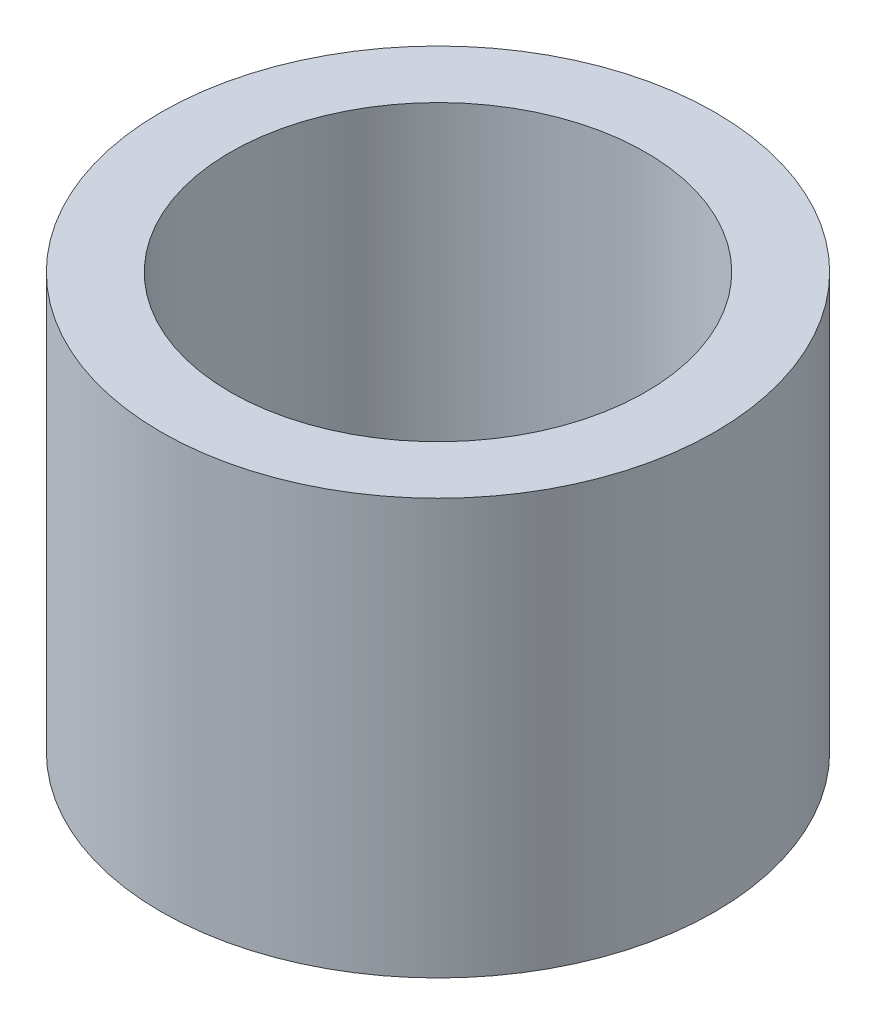
ISO-10303-21;
HEADER;
FILE_DESCRIPTION(('STEP AP214'),'2;1');
FILE_NAME('part.step','',(''),(''),'','','');
FILE_SCHEMA(('AUTOMOTIVE_DESIGN { 1 0 10303 214 1 1 1 1 }'));
ENDSEC;
DATA;
#1=APPLICATION_CONTEXT('core data for automotive mechanical design processes');
#2=APPLICATION_PROTOCOL_DEFINITION('international standard','automotive_design',2000,#1);
#3=PRODUCT_CONTEXT('',#1,'mechanical');
#4=PRODUCT('Part','Part','',(#3));
#5=PRODUCT_RELATED_PRODUCT_CATEGORY('part','',(#4));
#6=PRODUCT_DEFINITION_FORMATION('','',#4);
#7=PRODUCT_DEFINITION_CONTEXT('part definition',#1,'design');
#8=PRODUCT_DEFINITION('design','',#6,#7);
#9=PRODUCT_DEFINITION_SHAPE('','',#8);
#10=(LENGTH_UNIT() NAMED_UNIT(*) SI_UNIT(.MILLI.,.METRE.));
#11=(NAMED_UNIT(*) PLANE_ANGLE_UNIT() SI_UNIT($,.RADIAN.));
#12=(NAMED_UNIT(*) SI_UNIT($,.STERADIAN.) SOLID_ANGLE_UNIT());
#13=UNCERTAINTY_MEASURE_WITH_UNIT(LENGTH_MEASURE(1.E-05),#10,'distance_accuracy_value','');
#14=(GEOMETRIC_REPRESENTATION_CONTEXT(3) GLOBAL_UNCERTAINTY_ASSIGNED_CONTEXT((#13)) GLOBAL_UNIT_ASSIGNED_CONTEXT((#10,
#11,#12)) REPRESENTATION_CONTEXT('',''));
#15=CARTESIAN_POINT('',(0.,0.,0.));
#16=DIRECTION('',(0.,0.,1.));
#17=DIRECTION('',(1.,0.,0.));
#18=AXIS2_PLACEMENT_3D('',#15,#16,#17);
#19=CARTESIAN_POINT('',(0.,6.,0.));
#20=DIRECTION('',(0.,1.,0.));
#21=DIRECTION('',(0.,0.,1.));
#22=AXIS2_PLACEMENT_3D('',#19,#20,#21);
#23=PLANE('',#22);
#24=CARTESIAN_POINT('',(0.,6.,0.));
#25=DIRECTION('',(0.,1.,0.));
#26=DIRECTION('',(0.,0.,1.));
#27=AXIS2_PLACEMENT_3D('',#24,#25,#26);
#28=CIRCLE('',#27,4.);
#29=CARTESIAN_POINT('',(0.,6.,4.));
#30=VERTEX_POINT('',#29);
#31=EDGE_CURVE('E10',#30,#30,#28,.T.);
#32=ORIENTED_EDGE('',*,*,#31,.T.);
#33=EDGE_LOOP('',(#32));
#34=FACE_BOUND('',#33,.T.);
#35=CARTESIAN_POINT('',(0.,6.,0.));
#36=DIRECTION('',(0.,1.,0.));
#37=DIRECTION('',(0.,0.,1.));
#38=AXIS2_PLACEMENT_3D('',#35,#36,#37);
#39=CIRCLE('',#38,3.);
#40=CARTESIAN_POINT('',(0.,6.,3.));
#41=VERTEX_POINT('',#40);
#42=EDGE_CURVE('E50',#41,#41,#39,.T.);
#43=ORIENTED_EDGE('',*,*,#42,.F.);
#44=EDGE_LOOP('',(#43));
#45=FACE_BOUND('',#44,.T.);
#46=ADVANCED_FACE('F37',(#34,#45),#23,.T.);
#47=CARTESIAN_POINT('',(0.,0.,0.));
#48=DIRECTION('',(0.,1.,0.));
#49=DIRECTION('',(0.,0.,1.));
#50=AXIS2_PLACEMENT_3D('',#47,#48,#49);
#51=PLANE('',#50);
#52=CARTESIAN_POINT('',(0.,0.,0.));
#53=DIRECTION('',(0.,1.,0.));
#54=DIRECTION('',(0.,0.,1.));
#55=AXIS2_PLACEMENT_3D('',#52,#53,#54);
#56=CIRCLE('',#55,4.);
#57=CARTESIAN_POINT('',(0.,0.,4.));
#58=VERTEX_POINT('',#57);
#59=EDGE_CURVE('E41',#58,#58,#56,.T.);
#60=ORIENTED_EDGE('',*,*,#59,.F.);
#61=EDGE_LOOP('',(#60));
#62=FACE_BOUND('',#61,.T.);
#63=CARTESIAN_POINT('',(0.,0.,0.));
#64=DIRECTION('',(0.,1.,0.));
#65=DIRECTION('',(0.,0.,1.));
#66=AXIS2_PLACEMENT_3D('',#63,#64,#65);
#67=CIRCLE('',#66,3.);
#68=CARTESIAN_POINT('',(0.,0.,3.));
#69=VERTEX_POINT('',#68);
#70=EDGE_CURVE('E52',#69,#69,#67,.T.);
#71=ORIENTED_EDGE('',*,*,#70,.T.);
#72=EDGE_LOOP('',(#71));
#73=FACE_BOUND('',#72,.T.);
#74=ADVANCED_FACE('F64',(#62,#73),#51,.F.);
#75=CARTESIAN_POINT('',(0.,6.,0.));
#76=DIRECTION('',(0.,-1.,0.));
#77=DIRECTION('',(0.,0.,-1.));
#78=AXIS2_PLACEMENT_3D('',#75,#76,#77);
#79=CYLINDRICAL_SURFACE('',#78,4.);
#80=ORIENTED_EDGE('',*,*,#31,.F.);
#81=EDGE_LOOP('',(#80));
#82=FACE_BOUND('',#81,.T.);
#83=ORIENTED_EDGE('',*,*,#59,.T.);
#84=EDGE_LOOP('',(#83));
#85=FACE_BOUND('',#84,.T.);
#86=ADVANCED_FACE('F39',(#82,#85),#79,.T.);
#87=CARTESIAN_POINT('',(0.,6.,0.));
#88=DIRECTION('',(0.,-1.,0.));
#89=DIRECTION('',(0.,0.,-1.));
#90=AXIS2_PLACEMENT_3D('',#87,#88,#89);
#91=CYLINDRICAL_SURFACE('',#90,3.);
#92=ORIENTED_EDGE('',*,*,#42,.T.);
#93=EDGE_LOOP('',(#92));
#94=FACE_BOUND('',#93,.T.);
#95=ORIENTED_EDGE('',*,*,#70,.F.);
#96=EDGE_LOOP('',(#95));
#97=FACE_BOUND('',#96,.T.);
#98=ADVANCED_FACE('F60',(#94,#97),#91,.F.);
#99=CLOSED_SHELL('',(#46,#74,#86,#98));
#100=MANIFOLD_SOLID_BREP('B2',#99);
#101=ADVANCED_BREP_SHAPE_REPRESENTATION('',(#18,#100),#14);
#102=SHAPE_DEFINITION_REPRESENTATION(#9,#101);
ENDSEC;
END-ISO-10303-21;
